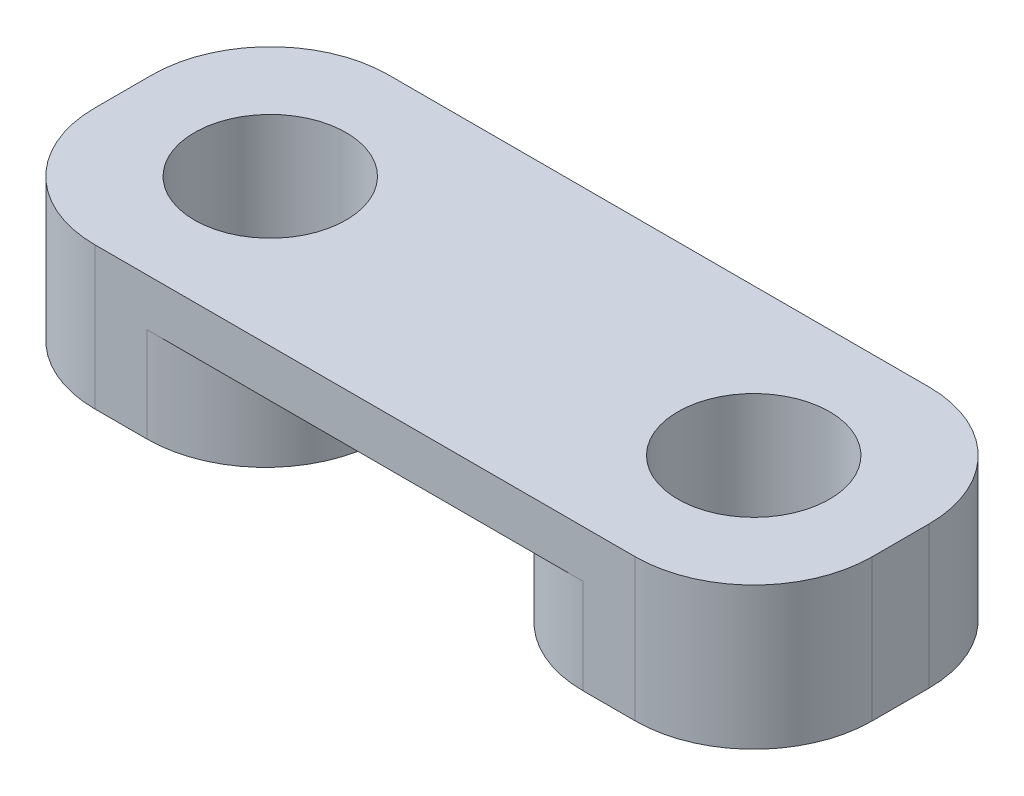
ISO-10303-21;
HEADER;
FILE_DESCRIPTION(('STEP AP214'),'2;1');
FILE_NAME('part.step','',(''),(''),'','','');
FILE_SCHEMA(('AUTOMOTIVE_DESIGN { 1 0 10303 214 1 1 1 1 }'));
ENDSEC;
DATA;
#1=APPLICATION_CONTEXT('core data for automotive mechanical design processes');
#2=APPLICATION_PROTOCOL_DEFINITION('international standard','automotive_design',2000,#1);
#3=PRODUCT_CONTEXT('',#1,'mechanical');
#4=PRODUCT('Part','Part','',(#3));
#5=PRODUCT_RELATED_PRODUCT_CATEGORY('part','',(#4));
#6=PRODUCT_DEFINITION_FORMATION('','',#4);
#7=PRODUCT_DEFINITION_CONTEXT('part definition',#1,'design');
#8=PRODUCT_DEFINITION('design','',#6,#7);
#9=PRODUCT_DEFINITION_SHAPE('','',#8);
#10=(LENGTH_UNIT() NAMED_UNIT(*) SI_UNIT(.MILLI.,.METRE.));
#11=(NAMED_UNIT(*) PLANE_ANGLE_UNIT() SI_UNIT($,.RADIAN.));
#12=(NAMED_UNIT(*) SI_UNIT($,.STERADIAN.) SOLID_ANGLE_UNIT());
#13=UNCERTAINTY_MEASURE_WITH_UNIT(LENGTH_MEASURE(1.E-05),#10,'distance_accuracy_value','');
#14=(GEOMETRIC_REPRESENTATION_CONTEXT(3) GLOBAL_UNCERTAINTY_ASSIGNED_CONTEXT((#13)) GLOBAL_UNIT_ASSIGNED_CONTEXT((#10,
#11,#12)) REPRESENTATION_CONTEXT('',''));
#15=CARTESIAN_POINT('',(0.,0.,0.));
#16=DIRECTION('',(0.,0.,1.));
#17=DIRECTION('',(1.,0.,0.));
#18=AXIS2_PLACEMENT_3D('',#15,#16,#17);
#19=CARTESIAN_POINT('',(0.,0.,0.));
#20=DIRECTION('',(0.,1.,0.));
#21=DIRECTION('',(0.,0.,1.));
#22=AXIS2_PLACEMENT_3D('',#19,#20,#21);
#23=PLANE('',#22);
#24=CARTESIAN_POINT('',(-5.0990195,0.,-3.1));
#25=DIRECTION('',(0.,1.,0.));
#26=DIRECTION('',(0.,0.,1.));
#27=AXIS2_PLACEMENT_3D('',#24,#25,#26);
#28=CIRCLE('',#27,1.6);
#29=CARTESIAN_POINT('',(-5.0990195,0.,-1.5));
#30=VERTEX_POINT('',#29);
#31=EDGE_CURVE('E281',#30,#30,#28,.T.);
#32=ORIENTED_EDGE('',*,*,#31,.T.);
#33=EDGE_LOOP('',(#32));
#34=FACE_BOUND('',#33,.T.);
#35=DIRECTION('',(-1.,0.,0.));
#36=VECTOR('',#35,1.);
#37=CARTESIAN_POINT('',(8.1990195,0.,-6.2));
#38=LINE('',#37,#36);
#39=CARTESIAN_POINT('',(-4.5990195,0.,-6.2));
#40=VERTEX_POINT('',#39);
#41=CARTESIAN_POINT('',(-5.6990195,0.,-6.2));
#42=VERTEX_POINT('',#41);
#43=EDGE_CURVE('E184',#40,#42,#38,.T.);
#44=ORIENTED_EDGE('',*,*,#43,.F.);
#45=CARTESIAN_POINT('',(-4.5990195,0.,-3.7));
#46=DIRECTION('',(0.,1.,0.));
#47=DIRECTION('',(0.,0.,1.));
#48=AXIS2_PLACEMENT_3D('',#45,#46,#47);
#49=CIRCLE('',#48,2.5);
#50=CARTESIAN_POINT('',(-2.0990195,0.,-3.7));
#51=VERTEX_POINT('',#50);
#52=EDGE_CURVE('E219',#40,#51,#49,.F.);
#53=ORIENTED_EDGE('',*,*,#52,.T.);
#54=DIRECTION('',(0.,0.,1.));
#55=VECTOR('',#54,1.);
#56=CARTESIAN_POINT('',(-2.0990195,0.,-6.2));
#57=LINE('',#56,#55);
#58=CARTESIAN_POINT('',(-2.0990195,0.,-2.5));
#59=VERTEX_POINT('',#58);
#60=EDGE_CURVE('E290',#51,#59,#57,.T.);
#61=ORIENTED_EDGE('',*,*,#60,.T.);
#62=CARTESIAN_POINT('',(-4.5990195,0.,-2.5));
#63=DIRECTION('',(0.,1.,0.));
#64=DIRECTION('',(0.,0.,1.));
#65=AXIS2_PLACEMENT_3D('',#62,#63,#64);
#66=CIRCLE('',#65,2.5);
#67=CARTESIAN_POINT('',(-4.5990195,0.,0.));
#68=VERTEX_POINT('',#67);
#69=EDGE_CURVE('E217',#59,#68,#66,.F.);
#70=ORIENTED_EDGE('',*,*,#69,.T.);
#71=DIRECTION('',(1.,0.,0.));
#72=VECTOR('',#71,1.);
#73=CARTESIAN_POINT('',(-8.1990195,0.,0.));
#74=LINE('',#73,#72);
#75=CARTESIAN_POINT('',(-5.6990195,0.,0.));
#76=VERTEX_POINT('',#75);
#77=EDGE_CURVE('E263',#76,#68,#74,.T.);
#78=ORIENTED_EDGE('',*,*,#77,.F.);
#79=CARTESIAN_POINT('',(-5.6990195,0.,-2.5));
#80=DIRECTION('',(0.,1.,0.));
#81=DIRECTION('',(0.,0.,1.));
#82=AXIS2_PLACEMENT_3D('',#79,#80,#81);
#83=CIRCLE('',#82,2.5);
#84=CARTESIAN_POINT('',(-8.1990195,0.,-2.5));
#85=VERTEX_POINT('',#84);
#86=EDGE_CURVE('E213',#76,#85,#83,.F.);
#87=ORIENTED_EDGE('',*,*,#86,.T.);
#88=DIRECTION('',(0.,0.,1.));
#89=VECTOR('',#88,1.);
#90=CARTESIAN_POINT('',(-8.1990195,0.,-6.2));
#91=LINE('',#90,#89);
#92=CARTESIAN_POINT('',(-8.1990195,0.,-3.7));
#93=VERTEX_POINT('',#92);
#94=EDGE_CURVE('E272',#93,#85,#91,.T.);
#95=ORIENTED_EDGE('',*,*,#94,.F.);
#96=CARTESIAN_POINT('',(-5.6990195,0.,-3.7));
#97=DIRECTION('',(0.,1.,0.));
#98=DIRECTION('',(0.,0.,1.));
#99=AXIS2_PLACEMENT_3D('',#96,#97,#98);
#100=CIRCLE('',#99,2.5);
#101=EDGE_CURVE('E215',#93,#42,#100,.F.);
#102=ORIENTED_EDGE('',*,*,#101,.T.);
#103=EDGE_LOOP('',(#44,#53,#61,#70,#78,#87,#95,#102));
#104=FACE_BOUND('',#103,.T.);
#105=ADVANCED_FACE('F36',(#34,#104),#23,.F.);
#106=CARTESIAN_POINT('',(0.,3.,0.));
#107=DIRECTION('',(0.,1.,0.));
#108=DIRECTION('',(0.,0.,1.));
#109=AXIS2_PLACEMENT_3D('',#106,#107,#108);
#110=PLANE('',#109);
#111=CARTESIAN_POINT('',(-5.0990195,3.,-3.1));
#112=DIRECTION('',(0.,1.,0.));
#113=DIRECTION('',(0.,0.,1.));
#114=AXIS2_PLACEMENT_3D('',#111,#112,#113);
#115=CIRCLE('',#114,1.6);
#116=CARTESIAN_POINT('',(-5.0990195,3.,-1.5));
#117=VERTEX_POINT('',#116);
#118=EDGE_CURVE('E273',#117,#117,#115,.T.);
#119=ORIENTED_EDGE('',*,*,#118,.F.);
#120=EDGE_LOOP('',(#119));
#121=FACE_BOUND('',#120,.T.);
#122=DIRECTION('',(0.,0.,-1.));
#123=VECTOR('',#122,1.);
#124=CARTESIAN_POINT('',(8.1990195,3.,0.));
#125=LINE('',#124,#123);
#126=CARTESIAN_POINT('',(8.1990195,3.,-2.5));
#127=VERTEX_POINT('',#126);
#128=CARTESIAN_POINT('',(8.1990195,3.,-3.7));
#129=VERTEX_POINT('',#128);
#130=EDGE_CURVE('E181',#127,#129,#125,.T.);
#131=ORIENTED_EDGE('',*,*,#130,.T.);
#132=CARTESIAN_POINT('',(5.6990195,3.,-3.7));
#133=DIRECTION('',(0.,1.,0.));
#134=DIRECTION('',(0.,0.,1.));
#135=AXIS2_PLACEMENT_3D('',#132,#133,#134);
#136=CIRCLE('',#135,2.5);
#137=CARTESIAN_POINT('',(5.6990195,3.,-6.2));
#138=VERTEX_POINT('',#137);
#139=EDGE_CURVE('E236',#129,#138,#136,.T.);
#140=ORIENTED_EDGE('',*,*,#139,.T.);
#141=DIRECTION('',(-1.,0.,0.));
#142=VECTOR('',#141,1.);
#143=CARTESIAN_POINT('',(8.1990195,3.,-6.2));
#144=LINE('',#143,#142);
#145=CARTESIAN_POINT('',(-5.6990195,3.,-6.2));
#146=VERTEX_POINT('',#145);
#147=EDGE_CURVE('E177',#138,#146,#144,.T.);
#148=ORIENTED_EDGE('',*,*,#147,.T.);
#149=CARTESIAN_POINT('',(-5.6990195,3.,-3.7));
#150=DIRECTION('',(0.,1.,0.));
#151=DIRECTION('',(0.,0.,1.));
#152=AXIS2_PLACEMENT_3D('',#149,#150,#151);
#153=CIRCLE('',#152,2.5);
#154=CARTESIAN_POINT('',(-8.1990195,3.,-3.7));
#155=VERTEX_POINT('',#154);
#156=EDGE_CURVE('E58',#146,#155,#153,.T.);
#157=ORIENTED_EDGE('',*,*,#156,.T.);
#158=DIRECTION('',(0.,0.,1.));
#159=VECTOR('',#158,1.);
#160=CARTESIAN_POINT('',(-8.1990195,3.,-6.2));
#161=LINE('',#160,#159);
#162=CARTESIAN_POINT('',(-8.1990195,3.,-2.5));
#163=VERTEX_POINT('',#162);
#164=EDGE_CURVE('E261',#155,#163,#161,.T.);
#165=ORIENTED_EDGE('',*,*,#164,.T.);
#166=CARTESIAN_POINT('',(-5.6990195,3.,-2.5));
#167=DIRECTION('',(0.,1.,0.));
#168=DIRECTION('',(0.,0.,1.));
#169=AXIS2_PLACEMENT_3D('',#166,#167,#168);
#170=CIRCLE('',#169,2.5);
#171=CARTESIAN_POINT('',(-5.6990195,3.,0.));
#172=VERTEX_POINT('',#171);
#173=EDGE_CURVE('E231',#163,#172,#170,.T.);
#174=ORIENTED_EDGE('',*,*,#173,.T.);
#175=DIRECTION('',(1.,0.,0.));
#176=VECTOR('',#175,1.);
#177=CARTESIAN_POINT('',(-8.1990195,3.,0.));
#178=LINE('',#177,#176);
#179=CARTESIAN_POINT('',(5.6990195,3.,0.));
#180=VERTEX_POINT('',#179);
#181=EDGE_CURVE('E277',#172,#180,#178,.T.);
#182=ORIENTED_EDGE('',*,*,#181,.T.);
#183=CARTESIAN_POINT('',(5.6990195,3.,-2.5));
#184=DIRECTION('',(0.,1.,0.));
#185=DIRECTION('',(0.,0.,1.));
#186=AXIS2_PLACEMENT_3D('',#183,#184,#185);
#187=CIRCLE('',#186,2.5);
#188=EDGE_CURVE('E234',#180,#127,#187,.T.);
#189=ORIENTED_EDGE('',*,*,#188,.T.);
#190=EDGE_LOOP('',(#131,#140,#148,#157,#165,#174,#182,#189));
#191=FACE_BOUND('',#190,.T.);
#192=CARTESIAN_POINT('',(5.0990195,3.,-3.1));
#193=DIRECTION('',(0.,1.,0.));
#194=DIRECTION('',(0.,0.,-1.));
#195=AXIS2_PLACEMENT_3D('',#192,#193,#194);
#196=CIRCLE('',#195,1.6);
#197=CARTESIAN_POINT('',(5.0990195,3.,-4.7));
#198=VERTEX_POINT('',#197);
#199=EDGE_CURVE('E284',#198,#198,#196,.T.);
#200=ORIENTED_EDGE('',*,*,#199,.F.);
#201=EDGE_LOOP('',(#200));
#202=FACE_BOUND('',#201,.T.);
#203=ADVANCED_FACE('F315',(#121,#191,#202),#110,.T.);
#204=CARTESIAN_POINT('',(4.5990195,0.,0.));
#205=VERTEX_POINT('',#204);
#206=CARTESIAN_POINT('',(5.6990195,0.,0.));
#207=VERTEX_POINT('',#206);
#208=EDGE_CURVE('E268',#205,#207,#74,.T.);
#209=ORIENTED_EDGE('',*,*,#208,.F.);
#210=CARTESIAN_POINT('',(4.5990195,0.,-2.5));
#211=DIRECTION('',(0.,1.,0.));
#212=DIRECTION('',(0.,0.,1.));
#213=AXIS2_PLACEMENT_3D('',#210,#211,#212);
#214=CIRCLE('',#213,2.5);
#215=CARTESIAN_POINT('',(2.0990195,0.,-2.5));
#216=VERTEX_POINT('',#215);
#217=EDGE_CURVE('E201',#205,#216,#214,.F.);
#218=ORIENTED_EDGE('',*,*,#217,.T.);
#219=DIRECTION('',(0.,0.,1.));
#220=VECTOR('',#219,1.);
#221=CARTESIAN_POINT('',(2.0990195,0.,-6.2));
#222=LINE('',#221,#220);
#223=CARTESIAN_POINT('',(2.0990195,0.,-3.7));
#224=VERTEX_POINT('',#223);
#225=EDGE_CURVE('E172',#224,#216,#222,.T.);
#226=ORIENTED_EDGE('',*,*,#225,.F.);
#227=CARTESIAN_POINT('',(4.5990195,0.,-3.7));
#228=DIRECTION('',(0.,1.,0.));
#229=DIRECTION('',(0.,0.,1.));
#230=AXIS2_PLACEMENT_3D('',#227,#228,#229);
#231=CIRCLE('',#230,2.5);
#232=CARTESIAN_POINT('',(4.5990195,0.,-6.2));
#233=VERTEX_POINT('',#232);
#234=EDGE_CURVE('E176',#224,#233,#231,.F.);
#235=ORIENTED_EDGE('',*,*,#234,.T.);
#236=CARTESIAN_POINT('',(5.6990195,0.,-6.2));
#237=VERTEX_POINT('',#236);
#238=EDGE_CURVE('E259',#237,#233,#38,.T.);
#239=ORIENTED_EDGE('',*,*,#238,.F.);
#240=CARTESIAN_POINT('',(5.6990195,0.,-3.7));
#241=DIRECTION('',(0.,1.,0.));
#242=DIRECTION('',(0.,0.,1.));
#243=AXIS2_PLACEMENT_3D('',#240,#241,#242);
#244=CIRCLE('',#243,2.5);
#245=CARTESIAN_POINT('',(8.1990195,0.,-3.7));
#246=VERTEX_POINT('',#245);
#247=EDGE_CURVE('E198',#237,#246,#244,.F.);
#248=ORIENTED_EDGE('',*,*,#247,.T.);
#249=DIRECTION('',(0.,0.,-1.));
#250=VECTOR('',#249,1.);
#251=CARTESIAN_POINT('',(8.1990195,0.,0.));
#252=LINE('',#251,#250);
#253=CARTESIAN_POINT('',(8.1990195,0.,-2.5));
#254=VERTEX_POINT('',#253);
#255=EDGE_CURVE('E260',#254,#246,#252,.T.);
#256=ORIENTED_EDGE('',*,*,#255,.F.);
#257=CARTESIAN_POINT('',(5.6990195,0.,-2.5));
#258=DIRECTION('',(0.,1.,0.));
#259=DIRECTION('',(0.,0.,1.));
#260=AXIS2_PLACEMENT_3D('',#257,#258,#259);
#261=CIRCLE('',#260,2.5);
#262=EDGE_CURVE('E196',#254,#207,#261,.F.);
#263=ORIENTED_EDGE('',*,*,#262,.T.);
#264=EDGE_LOOP('',(#209,#218,#226,#235,#239,#248,#256,#263));
#265=FACE_BOUND('',#264,.T.);
#266=CARTESIAN_POINT('',(5.0990195,0.,-3.1));
#267=DIRECTION('',(0.,1.,0.));
#268=DIRECTION('',(0.,0.,-1.));
#269=AXIS2_PLACEMENT_3D('',#266,#267,#268);
#270=CIRCLE('',#269,1.6);
#271=CARTESIAN_POINT('',(5.0990195,0.,-4.7));
#272=VERTEX_POINT('',#271);
#273=EDGE_CURVE('E287',#272,#272,#270,.T.);
#274=ORIENTED_EDGE('',*,*,#273,.T.);
#275=EDGE_LOOP('',(#274));
#276=FACE_BOUND('',#275,.T.);
#277=ADVANCED_FACE('F342',(#265,#276),#23,.F.);
#278=CARTESIAN_POINT('',(-8.1990195,3.,-6.2));
#279=DIRECTION('',(1.,0.,0.));
#280=DIRECTION('',(0.,0.,-1.));
#281=AXIS2_PLACEMENT_3D('',#278,#279,#280);
#282=PLANE('',#281);
#283=ORIENTED_EDGE('',*,*,#164,.F.);
#284=DIRECTION('',(0.,-1.,0.));
#285=VECTOR('',#284,1.);
#286=CARTESIAN_POINT('',(-8.1990195,3.,-3.7));
#287=LINE('',#286,#285);
#288=EDGE_CURVE('E239',#155,#93,#287,.T.);
#289=ORIENTED_EDGE('',*,*,#288,.T.);
#290=ORIENTED_EDGE('',*,*,#94,.T.);
#291=DIRECTION('',(0.,-1.,0.));
#292=VECTOR('',#291,1.);
#293=CARTESIAN_POINT('',(-8.1990195,3.,-2.5));
#294=LINE('',#293,#292);
#295=EDGE_CURVE('E51',#85,#163,#294,.F.);
#296=ORIENTED_EDGE('',*,*,#295,.T.);
#297=EDGE_LOOP('',(#283,#289,#290,#296));
#298=FACE_BOUND('',#297,.T.);
#299=ADVANCED_FACE('F311',(#298),#282,.F.);
#300=CARTESIAN_POINT('',(-8.1990195,3.,0.));
#301=DIRECTION('',(0.,0.,-1.));
#302=DIRECTION('',(-1.,0.,0.));
#303=AXIS2_PLACEMENT_3D('',#300,#301,#302);
#304=PLANE('',#303);
#305=DIRECTION('',(-1.,0.,0.));
#306=VECTOR('',#305,1.);
#307=CARTESIAN_POINT('',(-2.0990195,2.,0.));
#308=LINE('',#307,#306);
#309=CARTESIAN_POINT('',(4.5990195,2.,0.));
#310=VERTEX_POINT('',#309);
#311=CARTESIAN_POINT('',(-4.5990195,2.,0.));
#312=VERTEX_POINT('',#311);
#313=EDGE_CURVE('E296',#310,#312,#308,.T.);
#314=ORIENTED_EDGE('',*,*,#313,.F.);
#315=DIRECTION('',(0.,1.,0.));
#316=VECTOR('',#315,1.);
#317=CARTESIAN_POINT('',(4.5990195,3.,0.));
#318=LINE('',#317,#316);
#319=EDGE_CURVE('E194',#310,#205,#318,.F.);
#320=ORIENTED_EDGE('',*,*,#319,.T.);
#321=ORIENTED_EDGE('',*,*,#208,.T.);
#322=DIRECTION('',(0.,-1.,0.));
#323=VECTOR('',#322,1.);
#324=CARTESIAN_POINT('',(5.6990195,3.,0.));
#325=LINE('',#324,#323);
#326=EDGE_CURVE('E189',#207,#180,#325,.F.);
#327=ORIENTED_EDGE('',*,*,#326,.T.);
#328=ORIENTED_EDGE('',*,*,#181,.F.);
#329=DIRECTION('',(0.,-1.,0.));
#330=VECTOR('',#329,1.);
#331=CARTESIAN_POINT('',(-5.6990195,3.,0.));
#332=LINE('',#331,#330);
#333=EDGE_CURVE('E179',#172,#76,#332,.T.);
#334=ORIENTED_EDGE('',*,*,#333,.T.);
#335=ORIENTED_EDGE('',*,*,#77,.T.);
#336=DIRECTION('',(0.,-1.,0.));
#337=VECTOR('',#336,1.);
#338=CARTESIAN_POINT('',(-4.5990195,3.,0.));
#339=LINE('',#338,#337);
#340=EDGE_CURVE('E191',#68,#312,#339,.F.);
#341=ORIENTED_EDGE('',*,*,#340,.T.);
#342=EDGE_LOOP('',(#314,#320,#321,#327,#328,#334,#335,#341));
#343=FACE_BOUND('',#342,.T.);
#344=ADVANCED_FACE('F302',(#343),#304,.F.);
#345=CARTESIAN_POINT('',(8.1990195,3.,0.));
#346=DIRECTION('',(-1.,0.,0.));
#347=DIRECTION('',(0.,0.,1.));
#348=AXIS2_PLACEMENT_3D('',#345,#346,#347);
#349=PLANE('',#348);
#350=ORIENTED_EDGE('',*,*,#255,.T.);
#351=DIRECTION('',(0.,-1.,0.));
#352=VECTOR('',#351,1.);
#353=CARTESIAN_POINT('',(8.1990195,3.,-3.7));
#354=LINE('',#353,#352);
#355=EDGE_CURVE('E229',#246,#129,#354,.F.);
#356=ORIENTED_EDGE('',*,*,#355,.T.);
#357=ORIENTED_EDGE('',*,*,#130,.F.);
#358=DIRECTION('',(0.,-1.,0.));
#359=VECTOR('',#358,1.);
#360=CARTESIAN_POINT('',(8.1990195,3.,-2.5));
#361=LINE('',#360,#359);
#362=EDGE_CURVE('E226',#127,#254,#361,.T.);
#363=ORIENTED_EDGE('',*,*,#362,.T.);
#364=EDGE_LOOP('',(#350,#356,#357,#363));
#365=FACE_BOUND('',#364,.T.);
#366=ADVANCED_FACE('F325',(#365),#349,.F.);
#367=CARTESIAN_POINT('',(8.1990195,3.,-6.2));
#368=DIRECTION('',(0.,0.,1.));
#369=DIRECTION('',(1.,0.,0.));
#370=AXIS2_PLACEMENT_3D('',#367,#368,#369);
#371=PLANE('',#370);
#372=ORIENTED_EDGE('',*,*,#238,.T.);
#373=DIRECTION('',(0.,1.,0.));
#374=VECTOR('',#373,1.);
#375=CARTESIAN_POINT('',(4.5990195,3.,-6.2));
#376=LINE('',#375,#374);
#377=CARTESIAN_POINT('',(4.5990195,2.,-6.2));
#378=VERTEX_POINT('',#377);
#379=EDGE_CURVE('E211',#233,#378,#376,.T.);
#380=ORIENTED_EDGE('',*,*,#379,.T.);
#381=DIRECTION('',(-1.,0.,0.));
#382=VECTOR('',#381,1.);
#383=CARTESIAN_POINT('',(-2.0990195,2.,-6.2));
#384=LINE('',#383,#382);
#385=CARTESIAN_POINT('',(-4.5990195,2.,-6.2));
#386=VERTEX_POINT('',#385);
#387=EDGE_CURVE('E156',#378,#386,#384,.T.);
#388=ORIENTED_EDGE('',*,*,#387,.T.);
#389=DIRECTION('',(0.,-1.,0.));
#390=VECTOR('',#389,1.);
#391=CARTESIAN_POINT('',(-4.5990195,3.,-6.2));
#392=LINE('',#391,#390);
#393=EDGE_CURVE('E208',#386,#40,#392,.T.);
#394=ORIENTED_EDGE('',*,*,#393,.T.);
#395=ORIENTED_EDGE('',*,*,#43,.T.);
#396=DIRECTION('',(0.,-1.,0.));
#397=VECTOR('',#396,1.);
#398=CARTESIAN_POINT('',(-5.6990195,3.,-6.2));
#399=LINE('',#398,#397);
#400=EDGE_CURVE('E203',#42,#146,#399,.F.);
#401=ORIENTED_EDGE('',*,*,#400,.T.);
#402=ORIENTED_EDGE('',*,*,#147,.F.);
#403=DIRECTION('',(0.,-1.,0.));
#404=VECTOR('',#403,1.);
#405=CARTESIAN_POINT('',(5.6990195,3.,-6.2));
#406=LINE('',#405,#404);
#407=EDGE_CURVE('E205',#138,#237,#406,.T.);
#408=ORIENTED_EDGE('',*,*,#407,.T.);
#409=EDGE_LOOP('',(#372,#380,#388,#394,#395,#401,#402,#408));
#410=FACE_BOUND('',#409,.T.);
#411=ADVANCED_FACE('F253',(#410),#371,.F.);
#412=CARTESIAN_POINT('',(-5.0990195,3.,-3.1));
#413=DIRECTION('',(0.,-1.,0.));
#414=DIRECTION('',(0.,0.,-1.));
#415=AXIS2_PLACEMENT_3D('',#412,#413,#414);
#416=CYLINDRICAL_SURFACE('',#415,1.6);
#417=ORIENTED_EDGE('',*,*,#118,.T.);
#418=EDGE_LOOP('',(#417));
#419=FACE_BOUND('',#418,.T.);
#420=ORIENTED_EDGE('',*,*,#31,.F.);
#421=EDGE_LOOP('',(#420));
#422=FACE_BOUND('',#421,.T.);
#423=ADVANCED_FACE('F361',(#419,#422),#416,.F.);
#424=CARTESIAN_POINT('',(5.0990195,3.,-3.1));
#425=DIRECTION('',(0.,-1.,0.));
#426=DIRECTION('',(0.,0.,-1.));
#427=AXIS2_PLACEMENT_3D('',#424,#425,#426);
#428=CYLINDRICAL_SURFACE('',#427,1.6);
#429=ORIENTED_EDGE('',*,*,#199,.T.);
#430=EDGE_LOOP('',(#429));
#431=FACE_BOUND('',#430,.T.);
#432=ORIENTED_EDGE('',*,*,#273,.F.);
#433=EDGE_LOOP('',(#432));
#434=FACE_BOUND('',#433,.T.);
#435=ADVANCED_FACE('F359',(#431,#434),#428,.F.);
#436=CARTESIAN_POINT('',(-2.0990195,0.,-6.2));
#437=DIRECTION('',(-1.,0.,0.));
#438=DIRECTION('',(0.,-1.,0.));
#439=AXIS2_PLACEMENT_3D('',#436,#437,#438);
#440=PLANE('',#439);
#441=ORIENTED_EDGE('',*,*,#60,.F.);
#442=DIRECTION('',(0.,-1.,0.));
#443=VECTOR('',#442,1.);
#444=CARTESIAN_POINT('',(-2.0990195,0.,-3.7));
#445=LINE('',#444,#443);
#446=CARTESIAN_POINT('',(-2.0990195,2.,-3.7));
#447=VERTEX_POINT('',#446);
#448=EDGE_CURVE('E224',#51,#447,#445,.F.);
#449=ORIENTED_EDGE('',*,*,#448,.T.);
#450=DIRECTION('',(0.,0.,1.));
#451=VECTOR('',#450,1.);
#452=CARTESIAN_POINT('',(-2.0990195,2.,-6.2));
#453=LINE('',#452,#451);
#454=CARTESIAN_POINT('',(-2.0990195,2.,-2.5));
#455=VERTEX_POINT('',#454);
#456=EDGE_CURVE('E171',#447,#455,#453,.T.);
#457=ORIENTED_EDGE('',*,*,#456,.T.);
#458=DIRECTION('',(0.,-1.,0.));
#459=VECTOR('',#458,1.);
#460=CARTESIAN_POINT('',(-2.0990195,0.,-2.5));
#461=LINE('',#460,#459);
#462=EDGE_CURVE('E221',#455,#59,#461,.T.);
#463=ORIENTED_EDGE('',*,*,#462,.T.);
#464=EDGE_LOOP('',(#441,#449,#457,#463));
#465=FACE_BOUND('',#464,.T.);
#466=ADVANCED_FACE('F308',(#465),#440,.F.);
#467=CARTESIAN_POINT('',(-2.0990195,2.,-6.2));
#468=DIRECTION('',(0.,1.,0.));
#469=DIRECTION('',(-1.,0.,0.));
#470=AXIS2_PLACEMENT_3D('',#467,#468,#469);
#471=PLANE('',#470);
#472=ORIENTED_EDGE('',*,*,#313,.T.);
#473=CARTESIAN_POINT('',(-4.5990195,2.,-2.5));
#474=DIRECTION('',(0.,1.,0.));
#475=DIRECTION('',(-1.,0.,0.));
#476=AXIS2_PLACEMENT_3D('',#473,#474,#475);
#477=CIRCLE('',#476,2.5);
#478=EDGE_CURVE('E11',#312,#455,#477,.T.);
#479=ORIENTED_EDGE('',*,*,#478,.T.);
#480=ORIENTED_EDGE('',*,*,#456,.F.);
#481=CARTESIAN_POINT('',(-4.5990195,2.,-3.7));
#482=DIRECTION('',(0.,1.,0.));
#483=DIRECTION('',(-1.,0.,0.));
#484=AXIS2_PLACEMENT_3D('',#481,#482,#483);
#485=CIRCLE('',#484,2.5);
#486=EDGE_CURVE('E44',#447,#386,#485,.T.);
#487=ORIENTED_EDGE('',*,*,#486,.T.);
#488=ORIENTED_EDGE('',*,*,#387,.F.);
#489=CARTESIAN_POINT('',(4.5990195,2.,-3.7));
#490=DIRECTION('',(0.,1.,0.));
#491=DIRECTION('',(-1.,0.,0.));
#492=AXIS2_PLACEMENT_3D('',#489,#490,#491);
#493=CIRCLE('',#492,2.5);
#494=CARTESIAN_POINT('',(2.0990195,2.,-3.7));
#495=VERTEX_POINT('',#494);
#496=EDGE_CURVE('E150',#378,#495,#493,.T.);
#497=ORIENTED_EDGE('',*,*,#496,.T.);
#498=DIRECTION('',(0.,0.,1.));
#499=VECTOR('',#498,1.);
#500=CARTESIAN_POINT('',(2.0990195,2.,-6.2));
#501=LINE('',#500,#499);
#502=CARTESIAN_POINT('',(2.0990195,2.,-2.5));
#503=VERTEX_POINT('',#502);
#504=EDGE_CURVE('E154',#495,#503,#501,.T.);
#505=ORIENTED_EDGE('',*,*,#504,.T.);
#506=CARTESIAN_POINT('',(4.5990195,2.,-2.5));
#507=DIRECTION('',(0.,1.,0.));
#508=DIRECTION('',(-1.,0.,0.));
#509=AXIS2_PLACEMENT_3D('',#506,#507,#508);
#510=CIRCLE('',#509,2.5);
#511=EDGE_CURVE('E161',#503,#310,#510,.T.);
#512=ORIENTED_EDGE('',*,*,#511,.T.);
#513=EDGE_LOOP('',(#472,#479,#480,#487,#488,#497,#505,#512));
#514=FACE_BOUND('',#513,.T.);
#515=ADVANCED_FACE('F152',(#514),#471,.F.);
#516=CARTESIAN_POINT('',(2.0990195,2.,-6.2));
#517=DIRECTION('',(1.,0.,0.));
#518=DIRECTION('',(0.,1.,0.));
#519=AXIS2_PLACEMENT_3D('',#516,#517,#518);
#520=PLANE('',#519);
#521=ORIENTED_EDGE('',*,*,#225,.T.);
#522=DIRECTION('',(0.,1.,0.));
#523=VECTOR('',#522,1.);
#524=CARTESIAN_POINT('',(2.0990195,2.,-2.5));
#525=LINE('',#524,#523);
#526=EDGE_CURVE('E170',#216,#503,#525,.T.);
#527=ORIENTED_EDGE('',*,*,#526,.T.);
#528=ORIENTED_EDGE('',*,*,#504,.F.);
#529=DIRECTION('',(0.,1.,0.));
#530=VECTOR('',#529,1.);
#531=CARTESIAN_POINT('',(2.0990195,2.,-3.7));
#532=LINE('',#531,#530);
#533=EDGE_CURVE('E167',#495,#224,#532,.F.);
#534=ORIENTED_EDGE('',*,*,#533,.T.);
#535=EDGE_LOOP('',(#521,#527,#528,#534));
#536=FACE_BOUND('',#535,.T.);
#537=ADVANCED_FACE('F166',(#536),#520,.F.);
#538=CARTESIAN_POINT('',(4.5990195,2.,-2.5));
#539=DIRECTION('',(0.,1.,0.));
#540=DIRECTION('',(-1.,0.,0.));
#541=AXIS2_PLACEMENT_3D('',#538,#539,#540);
#542=CYLINDRICAL_SURFACE('',#541,2.5);
#543=ORIENTED_EDGE('',*,*,#217,.F.);
#544=ORIENTED_EDGE('',*,*,#319,.F.);
#545=ORIENTED_EDGE('',*,*,#511,.F.);
#546=ORIENTED_EDGE('',*,*,#526,.F.);
#547=EDGE_LOOP('',(#543,#544,#545,#546));
#548=FACE_BOUND('',#547,.T.);
#549=ADVANCED_FACE('F374',(#548),#542,.T.);
#550=CARTESIAN_POINT('',(4.5990195,3.,-3.7));
#551=DIRECTION('',(0.,1.,0.));
#552=DIRECTION('',(-1.,0.,0.));
#553=AXIS2_PLACEMENT_3D('',#550,#551,#552);
#554=CYLINDRICAL_SURFACE('',#553,2.5);
#555=ORIENTED_EDGE('',*,*,#234,.F.);
#556=ORIENTED_EDGE('',*,*,#533,.F.);
#557=ORIENTED_EDGE('',*,*,#496,.F.);
#558=ORIENTED_EDGE('',*,*,#379,.F.);
#559=EDGE_LOOP('',(#555,#556,#557,#558));
#560=FACE_BOUND('',#559,.T.);
#561=ADVANCED_FACE('F175',(#560),#554,.T.);
#562=CARTESIAN_POINT('',(-4.5990195,3.,-3.7));
#563=DIRECTION('',(0.,-1.,0.));
#564=DIRECTION('',(1.,0.,0.));
#565=AXIS2_PLACEMENT_3D('',#562,#563,#564);
#566=CYLINDRICAL_SURFACE('',#565,2.5);
#567=ORIENTED_EDGE('',*,*,#486,.F.);
#568=ORIENTED_EDGE('',*,*,#448,.F.);
#569=ORIENTED_EDGE('',*,*,#52,.F.);
#570=ORIENTED_EDGE('',*,*,#393,.F.);
#571=EDGE_LOOP('',(#567,#568,#569,#570));
#572=FACE_BOUND('',#571,.T.);
#573=ADVANCED_FACE('F248',(#572),#566,.T.);
#574=CARTESIAN_POINT('',(-4.5990195,0.,-2.5));
#575=DIRECTION('',(0.,-1.,0.));
#576=DIRECTION('',(1.,0.,0.));
#577=AXIS2_PLACEMENT_3D('',#574,#575,#576);
#578=CYLINDRICAL_SURFACE('',#577,2.5);
#579=ORIENTED_EDGE('',*,*,#478,.F.);
#580=ORIENTED_EDGE('',*,*,#340,.F.);
#581=ORIENTED_EDGE('',*,*,#69,.F.);
#582=ORIENTED_EDGE('',*,*,#462,.F.);
#583=EDGE_LOOP('',(#579,#580,#581,#582));
#584=FACE_BOUND('',#583,.T.);
#585=ADVANCED_FACE('F306',(#584),#578,.T.);
#586=CARTESIAN_POINT('',(5.6990195,3.,-3.7));
#587=DIRECTION('',(0.,-1.,0.));
#588=DIRECTION('',(0.,0.,-1.));
#589=AXIS2_PLACEMENT_3D('',#586,#587,#588);
#590=CYLINDRICAL_SURFACE('',#589,2.5);
#591=ORIENTED_EDGE('',*,*,#139,.F.);
#592=ORIENTED_EDGE('',*,*,#355,.F.);
#593=ORIENTED_EDGE('',*,*,#247,.F.);
#594=ORIENTED_EDGE('',*,*,#407,.F.);
#595=EDGE_LOOP('',(#591,#592,#593,#594));
#596=FACE_BOUND('',#595,.T.);
#597=ADVANCED_FACE('F327',(#596),#590,.T.);
#598=CARTESIAN_POINT('',(5.6990195,3.,-2.5));
#599=DIRECTION('',(0.,-1.,0.));
#600=DIRECTION('',(0.,0.,-1.));
#601=AXIS2_PLACEMENT_3D('',#598,#599,#600);
#602=CYLINDRICAL_SURFACE('',#601,2.5);
#603=ORIENTED_EDGE('',*,*,#188,.F.);
#604=ORIENTED_EDGE('',*,*,#326,.F.);
#605=ORIENTED_EDGE('',*,*,#262,.F.);
#606=ORIENTED_EDGE('',*,*,#362,.F.);
#607=EDGE_LOOP('',(#603,#604,#605,#606));
#608=FACE_BOUND('',#607,.T.);
#609=ADVANCED_FACE('F321',(#608),#602,.T.);
#610=CARTESIAN_POINT('',(-5.6990195,3.,-3.7));
#611=DIRECTION('',(0.,-1.,0.));
#612=DIRECTION('',(0.,0.,-1.));
#613=AXIS2_PLACEMENT_3D('',#610,#611,#612);
#614=CYLINDRICAL_SURFACE('',#613,2.5);
#615=ORIENTED_EDGE('',*,*,#156,.F.);
#616=ORIENTED_EDGE('',*,*,#400,.F.);
#617=ORIENTED_EDGE('',*,*,#101,.F.);
#618=ORIENTED_EDGE('',*,*,#288,.F.);
#619=EDGE_LOOP('',(#615,#616,#617,#618));
#620=FACE_BOUND('',#619,.T.);
#621=ADVANCED_FACE('F332',(#620),#614,.T.);
#622=CARTESIAN_POINT('',(-5.6990195,3.,-2.5));
#623=DIRECTION('',(0.,-1.,0.));
#624=DIRECTION('',(0.,0.,-1.));
#625=AXIS2_PLACEMENT_3D('',#622,#623,#624);
#626=CYLINDRICAL_SURFACE('',#625,2.5);
#627=ORIENTED_EDGE('',*,*,#173,.F.);
#628=ORIENTED_EDGE('',*,*,#295,.F.);
#629=ORIENTED_EDGE('',*,*,#86,.F.);
#630=ORIENTED_EDGE('',*,*,#333,.F.);
#631=EDGE_LOOP('',(#627,#628,#629,#630));
#632=FACE_BOUND('',#631,.T.);
#633=ADVANCED_FACE('F38',(#632),#626,.T.);
#634=CLOSED_SHELL('',(#105,#203,#277,#299,#344,#366,#411,#423,#435,#466,#515,#537,#549,#561,
#573,#585,#597,#609,#621,#633));
#635=MANIFOLD_SOLID_BREP('B2',#634);
#636=ADVANCED_BREP_SHAPE_REPRESENTATION('',(#18,#635),#14);
#637=SHAPE_DEFINITION_REPRESENTATION(#9,#636);
ENDSEC;
END-ISO-10303-21;
